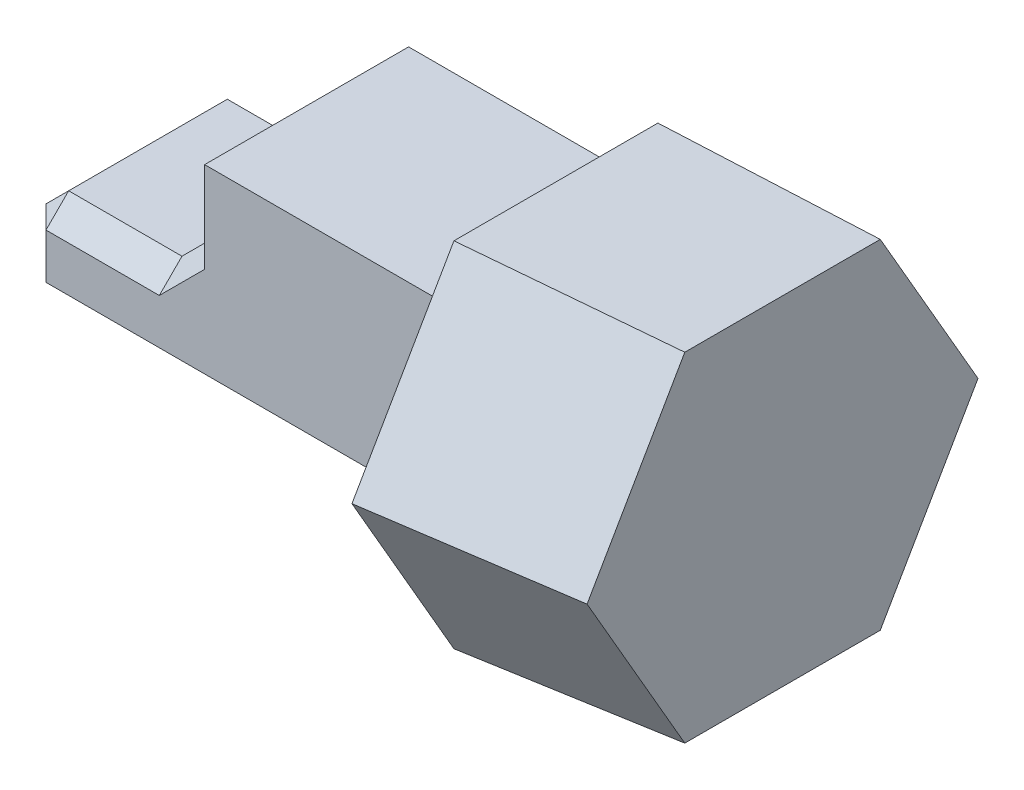
ISO-10303-21;
HEADER;
FILE_DESCRIPTION(('STEP AP214'),'2;1');
FILE_NAME('part.step','',(''),(''),'','','');
FILE_SCHEMA(('AUTOMOTIVE_DESIGN { 1 0 10303 214 1 1 1 1 }'));
ENDSEC;
DATA;
#1=APPLICATION_CONTEXT('core data for automotive mechanical design processes');
#2=APPLICATION_PROTOCOL_DEFINITION('international standard','automotive_design',2000,#1);
#3=PRODUCT_CONTEXT('',#1,'mechanical');
#4=PRODUCT('Part','Part','',(#3));
#5=PRODUCT_RELATED_PRODUCT_CATEGORY('part','',(#4));
#6=PRODUCT_DEFINITION_FORMATION('','',#4);
#7=PRODUCT_DEFINITION_CONTEXT('part definition',#1,'design');
#8=PRODUCT_DEFINITION('design','',#6,#7);
#9=PRODUCT_DEFINITION_SHAPE('','',#8);
#10=(LENGTH_UNIT() NAMED_UNIT(*) SI_UNIT(.MILLI.,.METRE.));
#11=(NAMED_UNIT(*) PLANE_ANGLE_UNIT() SI_UNIT($,.RADIAN.));
#12=(NAMED_UNIT(*) SI_UNIT($,.STERADIAN.) SOLID_ANGLE_UNIT());
#13=UNCERTAINTY_MEASURE_WITH_UNIT(LENGTH_MEASURE(1.E-05),#10,'distance_accuracy_value','');
#14=(GEOMETRIC_REPRESENTATION_CONTEXT(3) GLOBAL_UNCERTAINTY_ASSIGNED_CONTEXT((#13)) GLOBAL_UNIT_ASSIGNED_CONTEXT((#10,
#11,#12)) REPRESENTATION_CONTEXT('',''));
#15=CARTESIAN_POINT('',(0.,0.,0.));
#16=DIRECTION('',(0.,0.,1.));
#17=DIRECTION('',(1.,0.,0.));
#18=AXIS2_PLACEMENT_3D('',#15,#16,#17);
#19=CARTESIAN_POINT('',(0.,-6.59911357683742,3.81));
#20=DIRECTION('',(0.0809236037174117,-0.498360153493783,0.863185106319056));
#21=DIRECTION('',(0.,0.866025403784439,0.5));
#22=AXIS2_PLACEMENT_3D('',#19,#20,#21);
#23=PLANE('',#22);
#24=DIRECTION('',(0.9914964278646,0.12879916414384,-0.0185905580224614));
#25=VECTOR('',#24,1.);
#26=CARTESIAN_POINT('',(-50.8,-13.1982271536748,4.76250000000001));
#27=LINE('',#26,#25);
#28=CARTESIAN_POINT('',(-101.6,-19.7973407305123,5.71500000000002));
#29=VERTEX_POINT('',#28);
#30=CARTESIAN_POINT('',(-88.9,-18.1475623363029,5.47687500000001));
#31=VERTEX_POINT('',#30);
#32=EDGE_CURVE('E503',#29,#31,#27,.T.);
#33=ORIENTED_EDGE('',*,*,#32,.T.);
#34=DIRECTION('',(0.,0.866025403784439,0.5));
#35=VECTOR('',#34,1.);
#36=CARTESIAN_POINT('',(-88.9,-10.2080038141704,10.06078125));
#37=LINE('',#36,#35);
#38=CARTESIAN_POINT('',(-88.9,-8.66133656959912,10.95375));
#39=VERTEX_POINT('',#38);
#40=EDGE_CURVE('E475',#31,#39,#37,.T.);
#41=ORIENTED_EDGE('',*,*,#40,.T.);
#42=DIRECTION('',(-0.994594921525046,-0.096901252708014,0.0372973095571894));
#43=VECTOR('',#42,1.);
#44=CARTESIAN_POINT('',(-50.8,-4.94933518262807,9.52500000000001));
#45=LINE('',#44,#43);
#46=CARTESIAN_POINT('',(-101.6,-9.89867036525613,11.43));
#47=VERTEX_POINT('',#46);
#48=EDGE_CURVE('E135',#39,#47,#45,.T.);
#49=ORIENTED_EDGE('',*,*,#48,.T.);
#50=DIRECTION('',(0.,0.866025403784439,0.5));
#51=VECTOR('',#50,1.);
#52=CARTESIAN_POINT('',(-101.6,-19.7973407305123,5.71500000000002));
#53=LINE('',#52,#51);
#54=EDGE_CURVE('E315',#29,#47,#53,.T.);
#55=ORIENTED_EDGE('',*,*,#54,.F.);
#56=EDGE_LOOP('',(#33,#41,#49,#55));
#57=FACE_BOUND('',#56,.T.);
#58=ADVANCED_FACE('F131',(#57),#23,.T.);
#59=CARTESIAN_POINT('',(0.,0.,7.62));
#60=DIRECTION('',(-0.0162358359953752,0.499934095063922,0.865911253086682));
#61=DIRECTION('',(0.,0.866025403784439,-0.5));
#62=AXIS2_PLACEMENT_3D('',#59,#60,#61);
#63=PLANE('',#62);
#64=ORIENTED_EDGE('',*,*,#48,.F.);
#65=DIRECTION('',(0.,0.866025403784439,-0.5));
#66=VECTOR('',#65,1.);
#67=CARTESIAN_POINT('',(-88.9,-0.721778047466586,6.36984375000001));
#68=LINE('',#67,#66);
#69=CARTESIAN_POINT('',(-88.9,0.824889197104678,5.476875));
#70=VERTEX_POINT('',#69);
#71=EDGE_CURVE('E471',#39,#70,#68,.T.);
#72=ORIENTED_EDGE('',*,*,#71,.T.);
#73=DIRECTION('',(-0.997722646945075,-0.0648039868639116,0.0187072996302202));
#74=VECTOR('',#73,1.);
#75=CARTESIAN_POINT('',(-50.8,3.29955678841871,4.7625));
#76=LINE('',#75,#74);
#77=CARTESIAN_POINT('',(-101.6,0.,5.71500000000001));
#78=VERTEX_POINT('',#77);
#79=EDGE_CURVE('E299',#70,#78,#76,.T.);
#80=ORIENTED_EDGE('',*,*,#79,.T.);
#81=DIRECTION('',(0.,0.866025403784438,-0.500000000000001));
#82=VECTOR('',#81,1.);
#83=CARTESIAN_POINT('',(-101.6,-9.89867036525613,11.43));
#84=LINE('',#83,#82);
#85=EDGE_CURVE('E297',#47,#78,#84,.T.);
#86=ORIENTED_EDGE('',*,*,#85,.F.);
#87=EDGE_LOOP('',(#64,#72,#80,#86));
#88=FACE_BOUND('',#87,.T.);
#89=ADVANCED_FACE('F332',(#88),#63,.T.);
#90=CARTESIAN_POINT('',(0.,-6.59911357683742,-3.81));
#91=DIRECTION('',(0.128821426980026,-0.991667807257466,0.));
#92=DIRECTION('',(0.,0.,1.));
#93=AXIS2_PLACEMENT_3D('',#90,#91,#92);
#94=PLANE('',#93);
#95=DIRECTION('',(-0.9914964278646,-0.12879916414384,-0.0185905580224612));
#96=VECTOR('',#95,1.);
#97=CARTESIAN_POINT('',(-50.8,-13.1982271536748,-4.76249999999999));
#98=LINE('',#97,#96);
#99=CARTESIAN_POINT('',(-88.9,-18.1475623363029,-5.47687499999999));
#100=VERTEX_POINT('',#99);
#101=CARTESIAN_POINT('',(-101.6,-19.7973407305123,-5.71499999999999));
#102=VERTEX_POINT('',#101);
#103=EDGE_CURVE('E295',#100,#102,#98,.T.);
#104=ORIENTED_EDGE('',*,*,#103,.F.);
#105=DIRECTION('',(0.,0.,1.));
#106=VECTOR('',#105,1.);
#107=CARTESIAN_POINT('',(-88.9,-18.1475623363029,-3.81));
#108=LINE('',#107,#106);
#109=EDGE_CURVE('E149',#100,#31,#108,.T.);
#110=ORIENTED_EDGE('',*,*,#109,.T.);
#111=ORIENTED_EDGE('',*,*,#32,.F.);
#112=DIRECTION('',(0.,0.,1.));
#113=VECTOR('',#112,1.);
#114=CARTESIAN_POINT('',(-101.6,-19.7973407305123,0.));
#115=LINE('',#114,#113);
#116=CARTESIAN_POINT('',(-101.6,-19.7973407305123,0.));
#117=VERTEX_POINT('',#116);
#118=EDGE_CURVE('E510',#117,#29,#115,.T.);
#119=ORIENTED_EDGE('',*,*,#118,.F.);
#120=DIRECTION('',(0.,0.,1.));
#121=VECTOR('',#120,1.);
#122=CARTESIAN_POINT('',(-101.6,-19.7973407305123,-5.71499999999999));
#123=LINE('',#122,#121);
#124=EDGE_CURVE('E524',#102,#117,#123,.T.);
#125=ORIENTED_EDGE('',*,*,#124,.F.);
#126=EDGE_LOOP('',(#104,#110,#111,#119,#125));
#127=FACE_BOUND('',#126,.T.);
#128=ADVANCED_FACE('F338',(#127),#94,.T.);
#129=CARTESIAN_POINT('',(0.,6.59911357683743,3.81));
#130=DIRECTION('',(-0.0648153293418385,0.997897275816659,0.));
#131=DIRECTION('',(0.,0.,-1.));
#132=AXIS2_PLACEMENT_3D('',#129,#130,#131);
#133=PLANE('',#132);
#134=ORIENTED_EDGE('',*,*,#79,.F.);
#135=DIRECTION('',(0.,0.,-1.));
#136=VECTOR('',#135,1.);
#137=CARTESIAN_POINT('',(-88.9,0.824889197104679,3.81));
#138=LINE('',#137,#136);
#139=CARTESIAN_POINT('',(-88.9,0.824889197104678,-5.47687499999999));
#140=VERTEX_POINT('',#139);
#141=EDGE_CURVE('E288',#70,#140,#138,.T.);
#142=ORIENTED_EDGE('',*,*,#141,.T.);
#143=DIRECTION('',(-0.997722646945075,-0.0648039868639116,-0.0187072996302201));
#144=VECTOR('',#143,1.);
#145=CARTESIAN_POINT('',(-50.8,3.29955678841871,-4.76249999999999));
#146=LINE('',#145,#144);
#147=CARTESIAN_POINT('',(-101.6,0.,-5.71499999999999));
#148=VERTEX_POINT('',#147);
#149=EDGE_CURVE('E287',#140,#148,#146,.T.);
#150=ORIENTED_EDGE('',*,*,#149,.T.);
#151=DIRECTION('',(0.,0.,-1.));
#152=VECTOR('',#151,1.);
#153=CARTESIAN_POINT('',(-101.6,0.,0.));
#154=LINE('',#153,#152);
#155=CARTESIAN_POINT('',(-101.6,0.,0.));
#156=VERTEX_POINT('',#155);
#157=EDGE_CURVE('E463',#156,#148,#154,.T.);
#158=ORIENTED_EDGE('',*,*,#157,.F.);
#159=DIRECTION('',(0.,0.,-1.));
#160=VECTOR('',#159,1.);
#161=CARTESIAN_POINT('',(-101.6,0.,5.715));
#162=LINE('',#161,#160);
#163=EDGE_CURVE('E355',#78,#156,#162,.T.);
#164=ORIENTED_EDGE('',*,*,#163,.F.);
#165=EDGE_LOOP('',(#134,#142,#150,#158,#164));
#166=FACE_BOUND('',#165,.T.);
#167=ADVANCED_FACE('F361',(#166),#133,.T.);
#168=CARTESIAN_POINT('',(0.,6.59911357683742,-3.80999999999999));
#169=DIRECTION('',(-0.0162358359953753,0.499934095063922,-0.865911253086682));
#170=DIRECTION('',(0.,-0.866025403784438,-0.5));
#171=AXIS2_PLACEMENT_3D('',#168,#169,#170);
#172=PLANE('',#171);
#173=ORIENTED_EDGE('',*,*,#149,.F.);
#174=DIRECTION('',(0.,-0.866025403784438,-0.5));
#175=VECTOR('',#174,1.);
#176=CARTESIAN_POINT('',(-88.9,5.87733552937083,-2.55984374999999));
#177=LINE('',#176,#175);
#178=CARTESIAN_POINT('',(-88.9,-8.66133656959911,-10.95375));
#179=VERTEX_POINT('',#178);
#180=EDGE_CURVE('E276',#140,#179,#177,.T.);
#181=ORIENTED_EDGE('',*,*,#180,.T.);
#182=DIRECTION('',(-0.994594921525046,-0.096901252708014,-0.0372973095571892));
#183=VECTOR('',#182,1.);
#184=CARTESIAN_POINT('',(-50.8,-4.94933518262806,-9.52499999999999));
#185=LINE('',#184,#183);
#186=CARTESIAN_POINT('',(-101.6,-9.89867036525613,-11.43));
#187=VERTEX_POINT('',#186);
#188=EDGE_CURVE('E285',#179,#187,#185,.T.);
#189=ORIENTED_EDGE('',*,*,#188,.T.);
#190=DIRECTION('',(0.,-0.866025403784439,-0.5));
#191=VECTOR('',#190,1.);
#192=CARTESIAN_POINT('',(-101.6,0.,-5.71499999999999));
#193=LINE('',#192,#191);
#194=EDGE_CURVE('E382',#148,#187,#193,.T.);
#195=ORIENTED_EDGE('',*,*,#194,.F.);
#196=EDGE_LOOP('',(#173,#181,#189,#195));
#197=FACE_BOUND('',#196,.T.);
#198=ADVANCED_FACE('F283',(#197),#172,.T.);
#199=CARTESIAN_POINT('',(0.,0.,-7.61999999999999));
#200=DIRECTION('',(0.0809236037174114,-0.498360153493782,-0.863185106319057));
#201=DIRECTION('',(0.,-0.866025403784439,0.499999999999999));
#202=AXIS2_PLACEMENT_3D('',#199,#200,#201);
#203=PLANE('',#202);
#204=ORIENTED_EDGE('',*,*,#188,.F.);
#205=DIRECTION('',(0.,-0.866025403784439,0.499999999999999));
#206=VECTOR('',#205,1.);
#207=CARTESIAN_POINT('',(-88.9,-3.60889023733295,-13.87078125));
#208=LINE('',#207,#206);
#209=EDGE_CURVE('E12',#179,#100,#208,.T.);
#210=ORIENTED_EDGE('',*,*,#209,.T.);
#211=ORIENTED_EDGE('',*,*,#103,.T.);
#212=DIRECTION('',(0.,-0.866025403784439,0.5));
#213=VECTOR('',#212,1.);
#214=CARTESIAN_POINT('',(-101.6,-9.89867036525613,-11.43));
#215=LINE('',#214,#213);
#216=EDGE_CURVE('E292',#187,#102,#215,.T.);
#217=ORIENTED_EDGE('',*,*,#216,.F.);
#218=EDGE_LOOP('',(#204,#210,#211,#217));
#219=FACE_BOUND('',#218,.T.);
#220=ADVANCED_FACE('F290',(#219),#203,.T.);
#221=CARTESIAN_POINT('',(-116.84,0.,-5.71499999999999));
#222=DIRECTION('',(0.,0.,-1.));
#223=DIRECTION('',(-1.,0.,0.));
#224=AXIS2_PLACEMENT_3D('',#221,#222,#223);
#225=PLANE('',#224);
#226=DIRECTION('',(1.,0.,0.));
#227=VECTOR('',#226,1.);
#228=CARTESIAN_POINT('',(-116.84,-13.4473407305123,-5.71499999999999));
#229=LINE('',#228,#227);
#230=CARTESIAN_POINT('',(-124.46,-13.4473407305123,-5.71499999999999));
#231=VERTEX_POINT('',#230);
#232=CARTESIAN_POINT('',(-101.6,-13.4473407305123,-5.71499999999999));
#233=VERTEX_POINT('',#232);
#234=EDGE_CURVE('E495',#231,#233,#229,.T.);
#235=ORIENTED_EDGE('',*,*,#234,.F.);
#236=DIRECTION('',(0.,1.,0.));
#237=VECTOR('',#236,1.);
#238=CARTESIAN_POINT('',(-124.46,-9.63734073051227,-5.71499999999999));
#239=LINE('',#238,#237);
#240=CARTESIAN_POINT('',(-124.46,-10.9073407305123,-5.71499999999999));
#241=VERTEX_POINT('',#240);
#242=EDGE_CURVE('E795',#231,#241,#239,.T.);
#243=ORIENTED_EDGE('',*,*,#242,.T.);
#244=DIRECTION('',(1.,0.,0.));
#245=VECTOR('',#244,1.);
#246=CARTESIAN_POINT('',(-116.84,-10.9073407305123,-5.71499999999999));
#247=LINE('',#246,#245);
#248=CARTESIAN_POINT('',(-118.11,-10.9073407305123,-5.71499999999999));
#249=VERTEX_POINT('',#248);
#250=EDGE_CURVE('E804',#241,#249,#247,.T.);
#251=ORIENTED_EDGE('',*,*,#250,.T.);
#252=DIRECTION('',(-0.707106781186555,-0.70710678118654,0.));
#253=VECTOR('',#252,1.);
#254=CARTESIAN_POINT('',(-112.021329634744,-4.81867036525625,-5.71499999999999));
#255=LINE('',#254,#253);
#256=CARTESIAN_POINT('',(-116.84,-9.63734073051227,-5.71499999999999));
#257=VERTEX_POINT('',#256);
#258=EDGE_CURVE('E809',#257,#249,#255,.T.);
#259=ORIENTED_EDGE('',*,*,#258,.F.);
#260=DIRECTION('',(-0.707106781186555,-0.70710678118654,0.));
#261=VECTOR('',#260,1.);
#262=CARTESIAN_POINT('',(-112.021329634744,-4.81867036525625,-5.71499999999999));
#263=LINE('',#262,#261);
#264=CARTESIAN_POINT('',(-115.57,-8.36734073051227,-5.71499999999999));
#265=VERTEX_POINT('',#264);
#266=EDGE_CURVE('E901',#265,#257,#263,.T.);
#267=ORIENTED_EDGE('',*,*,#266,.F.);
#268=DIRECTION('',(0.,1.,0.));
#269=VECTOR('',#268,1.);
#270=CARTESIAN_POINT('',(-115.57,0.,-5.71499999999999));
#271=LINE('',#270,#269);
#272=CARTESIAN_POINT('',(-115.57,-3.28734073051226,-5.71499999999999));
#273=VERTEX_POINT('',#272);
#274=EDGE_CURVE('E895',#265,#273,#271,.T.);
#275=ORIENTED_EDGE('',*,*,#274,.T.);
#276=DIRECTION('',(1.,0.,0.));
#277=VECTOR('',#276,1.);
#278=CARTESIAN_POINT('',(-116.84,-3.28734073051226,-5.71499999999999));
#279=LINE('',#278,#277);
#280=CARTESIAN_POINT('',(-101.6,-3.28734073051226,-5.71499999999999));
#281=VERTEX_POINT('',#280);
#282=EDGE_CURVE('E497',#273,#281,#279,.T.);
#283=ORIENTED_EDGE('',*,*,#282,.T.);
#284=DIRECTION('',(0.,1.,0.));
#285=VECTOR('',#284,1.);
#286=CARTESIAN_POINT('',(-101.6,0.,-5.71499999999999));
#287=LINE('',#286,#285);
#288=EDGE_CURVE('E492',#233,#281,#287,.T.);
#289=ORIENTED_EDGE('',*,*,#288,.F.);
#290=EDGE_LOOP('',(#235,#243,#251,#259,#267,#275,#283,#289));
#291=FACE_BOUND('',#290,.T.);
#292=ADVANCED_FACE('F405',(#291),#225,.T.);
#293=CARTESIAN_POINT('',(-101.6,0.,0.));
#294=DIRECTION('',(-1.,0.,0.));
#295=DIRECTION('',(0.,0.,1.));
#296=AXIS2_PLACEMENT_3D('',#293,#294,#295);
#297=PLANE('',#296);
#298=DIRECTION('',(0.,0.,1.));
#299=VECTOR('',#298,1.);
#300=CARTESIAN_POINT('',(-101.6,-13.4473407305123,0.));
#301=LINE('',#300,#299);
#302=CARTESIAN_POINT('',(-101.6,-13.4473407305123,5.71500000000002));
#303=VERTEX_POINT('',#302);
#304=EDGE_CURVE('E482',#233,#303,#301,.T.);
#305=ORIENTED_EDGE('',*,*,#304,.F.);
#306=ORIENTED_EDGE('',*,*,#288,.T.);
#307=DIRECTION('',(0.,0.,1.));
#308=VECTOR('',#307,1.);
#309=CARTESIAN_POINT('',(-101.6,-3.28734073051226,0.));
#310=LINE('',#309,#308);
#311=CARTESIAN_POINT('',(-101.6,-3.28734073051226,5.71500000000002));
#312=VERTEX_POINT('',#311);
#313=EDGE_CURVE('E489',#281,#312,#310,.T.);
#314=ORIENTED_EDGE('',*,*,#313,.T.);
#315=DIRECTION('',(0.,1.,0.));
#316=VECTOR('',#315,1.);
#317=CARTESIAN_POINT('',(-101.6,0.,5.71500000000002));
#318=LINE('',#317,#316);
#319=EDGE_CURVE('E486',#303,#312,#318,.T.);
#320=ORIENTED_EDGE('',*,*,#319,.F.);
#321=EDGE_LOOP('',(#305,#306,#314,#320));
#322=FACE_BOUND('',#321,.T.);
#323=ORIENTED_EDGE('',*,*,#85,.T.);
#324=ORIENTED_EDGE('',*,*,#163,.T.);
#325=ORIENTED_EDGE('',*,*,#157,.T.);
#326=ORIENTED_EDGE('',*,*,#194,.T.);
#327=ORIENTED_EDGE('',*,*,#216,.T.);
#328=ORIENTED_EDGE('',*,*,#124,.T.);
#329=ORIENTED_EDGE('',*,*,#118,.T.);
#330=ORIENTED_EDGE('',*,*,#54,.T.);
#331=EDGE_LOOP('',(#323,#324,#325,#326,#327,#328,#329,#330));
#332=FACE_BOUND('',#331,.T.);
#333=ADVANCED_FACE('F406',(#322,#332),#297,.T.);
#334=CARTESIAN_POINT('',(-116.84,-13.4473407305123,0.));
#335=DIRECTION('',(0.,1.,0.));
#336=DIRECTION('',(0.,0.,1.));
#337=AXIS2_PLACEMENT_3D('',#334,#335,#336);
#338=PLANE('',#337);
#339=DIRECTION('',(0.,0.,1.));
#340=VECTOR('',#339,1.);
#341=CARTESIAN_POINT('',(-125.73,-13.4473407305123,-5.71499999999999));
#342=LINE('',#341,#340);
#343=CARTESIAN_POINT('',(-125.73,-13.4473407305123,-4.44499999999997));
#344=VERTEX_POINT('',#343);
#345=CARTESIAN_POINT('',(-125.73,-13.4473407305123,4.445));
#346=VERTEX_POINT('',#345);
#347=EDGE_CURVE('E479',#344,#346,#342,.T.);
#348=ORIENTED_EDGE('',*,*,#347,.F.);
#349=DIRECTION('',(0.707106781186555,0.,-0.70710678118654));
#350=VECTOR('',#349,1.);
#351=CARTESIAN_POINT('',(-125.73,-13.4473407305123,-4.44499999999997));
#352=LINE('',#351,#350);
#353=EDGE_CURVE('E800',#344,#231,#352,.T.);
#354=ORIENTED_EDGE('',*,*,#353,.T.);
#355=ORIENTED_EDGE('',*,*,#234,.T.);
#356=ORIENTED_EDGE('',*,*,#304,.T.);
#357=DIRECTION('',(1.,0.,0.));
#358=VECTOR('',#357,1.);
#359=CARTESIAN_POINT('',(-116.84,-13.4473407305123,5.71500000000002));
#360=LINE('',#359,#358);
#361=CARTESIAN_POINT('',(-124.46,-13.4473407305123,5.71500000000002));
#362=VERTEX_POINT('',#361);
#363=EDGE_CURVE('E501',#362,#303,#360,.T.);
#364=ORIENTED_EDGE('',*,*,#363,.F.);
#365=DIRECTION('',(0.707106781186556,0.,0.70710678118654));
#366=VECTOR('',#365,1.);
#367=CARTESIAN_POINT('',(-125.73,-13.4473407305123,4.445));
#368=LINE('',#367,#366);
#369=EDGE_CURVE('E887',#362,#346,#368,.F.);
#370=ORIENTED_EDGE('',*,*,#369,.T.);
#371=EDGE_LOOP('',(#348,#354,#355,#356,#364,#370));
#372=FACE_BOUND('',#371,.T.);
#373=ADVANCED_FACE('F333',(#372),#338,.F.);
#374=CARTESIAN_POINT('',(-116.84,0.,5.71500000000002));
#375=DIRECTION('',(0.,0.,-1.));
#376=DIRECTION('',(-1.,0.,0.));
#377=AXIS2_PLACEMENT_3D('',#374,#375,#376);
#378=PLANE('',#377);
#379=DIRECTION('',(-1.,0.,0.));
#380=VECTOR('',#379,1.);
#381=CARTESIAN_POINT('',(-116.84,-10.9073407305123,5.71500000000002));
#382=LINE('',#381,#380);
#383=CARTESIAN_POINT('',(-118.11,-10.9073407305123,5.71500000000002));
#384=VERTEX_POINT('',#383);
#385=CARTESIAN_POINT('',(-124.46,-10.9073407305123,5.71500000000002));
#386=VERTEX_POINT('',#385);
#387=EDGE_CURVE('E817',#384,#386,#382,.T.);
#388=ORIENTED_EDGE('',*,*,#387,.T.);
#389=DIRECTION('',(0.,-1.,0.));
#390=VECTOR('',#389,1.);
#391=CARTESIAN_POINT('',(-124.46,0.,5.71500000000002));
#392=LINE('',#391,#390);
#393=EDGE_CURVE('E819',#386,#362,#392,.T.);
#394=ORIENTED_EDGE('',*,*,#393,.T.);
#395=ORIENTED_EDGE('',*,*,#363,.T.);
#396=ORIENTED_EDGE('',*,*,#319,.T.);
#397=DIRECTION('',(1.,0.,0.));
#398=VECTOR('',#397,1.);
#399=CARTESIAN_POINT('',(-116.84,-3.28734073051226,5.71500000000002));
#400=LINE('',#399,#398);
#401=CARTESIAN_POINT('',(-115.57,-3.28734073051226,5.71500000000002));
#402=VERTEX_POINT('',#401);
#403=EDGE_CURVE('E499',#402,#312,#400,.T.);
#404=ORIENTED_EDGE('',*,*,#403,.F.);
#405=DIRECTION('',(0.,-1.,0.));
#406=VECTOR('',#405,1.);
#407=CARTESIAN_POINT('',(-115.57,-9.63734073051227,5.71500000000002));
#408=LINE('',#407,#406);
#409=CARTESIAN_POINT('',(-115.57,-8.36734073051227,5.71500000000002));
#410=VERTEX_POINT('',#409);
#411=EDGE_CURVE('E815',#402,#410,#408,.T.);
#412=ORIENTED_EDGE('',*,*,#411,.T.);
#413=DIRECTION('',(0.707106781186555,0.70710678118654,0.));
#414=VECTOR('',#413,1.);
#415=CARTESIAN_POINT('',(-115.57,-8.36734073051225,5.71500000000002));
#416=LINE('',#415,#414);
#417=CARTESIAN_POINT('',(-116.84,-9.63734073051227,5.71500000000002));
#418=VERTEX_POINT('',#417);
#419=EDGE_CURVE('E803',#418,#410,#416,.T.);
#420=ORIENTED_EDGE('',*,*,#419,.F.);
#421=DIRECTION('',(0.707106781186555,0.70710678118654,0.));
#422=VECTOR('',#421,1.);
#423=CARTESIAN_POINT('',(-115.57,-8.36734073051225,5.71500000000002));
#424=LINE('',#423,#422);
#425=EDGE_CURVE('E807',#384,#418,#424,.T.);
#426=ORIENTED_EDGE('',*,*,#425,.F.);
#427=EDGE_LOOP('',(#388,#394,#395,#396,#404,#412,#420,#426));
#428=FACE_BOUND('',#427,.T.);
#429=ADVANCED_FACE('F708',(#428),#378,.F.);
#430=CARTESIAN_POINT('',(-116.84,-3.28734073051226,0.));
#431=DIRECTION('',(0.,1.,0.));
#432=DIRECTION('',(0.,0.,1.));
#433=AXIS2_PLACEMENT_3D('',#430,#431,#432);
#434=PLANE('',#433);
#435=ORIENTED_EDGE('',*,*,#282,.F.);
#436=DIRECTION('',(0.,0.,1.));
#437=VECTOR('',#436,1.);
#438=CARTESIAN_POINT('',(-115.57,-3.28734073051226,0.));
#439=LINE('',#438,#437);
#440=EDGE_CURVE('E830',#273,#402,#439,.T.);
#441=ORIENTED_EDGE('',*,*,#440,.T.);
#442=ORIENTED_EDGE('',*,*,#403,.T.);
#443=ORIENTED_EDGE('',*,*,#313,.F.);
#444=EDGE_LOOP('',(#435,#441,#442,#443));
#445=FACE_BOUND('',#444,.T.);
#446=ADVANCED_FACE('F700',(#445),#434,.T.);
#447=CARTESIAN_POINT('',(-116.84,0.,0.));
#448=DIRECTION('',(-1.,0.,0.));
#449=DIRECTION('',(0.,0.,1.));
#450=AXIS2_PLACEMENT_3D('',#447,#448,#449);
#451=PLANE('',#450);
#452=DIRECTION('',(0.,1.,0.));
#453=VECTOR('',#452,1.);
#454=CARTESIAN_POINT('',(-116.84,-3.28734073051226,4.44500000000003));
#455=LINE('',#454,#453);
#456=CARTESIAN_POINT('',(-116.84,-8.36734073051227,4.44500000000003));
#457=VERTEX_POINT('',#456);
#458=CARTESIAN_POINT('',(-116.84,-4.55734073051226,4.44500000000003));
#459=VERTEX_POINT('',#458);
#460=EDGE_CURVE('E832',#457,#459,#455,.T.);
#461=ORIENTED_EDGE('',*,*,#460,.T.);
#462=DIRECTION('',(0.,0.,-1.));
#463=VECTOR('',#462,1.);
#464=CARTESIAN_POINT('',(-116.84,-4.55734073051226,0.));
#465=LINE('',#464,#463);
#466=CARTESIAN_POINT('',(-116.84,-4.55734073051226,-4.445));
#467=VERTEX_POINT('',#466);
#468=EDGE_CURVE('E141',#459,#467,#465,.T.);
#469=ORIENTED_EDGE('',*,*,#468,.T.);
#470=DIRECTION('',(0.,-1.,0.));
#471=VECTOR('',#470,1.);
#472=CARTESIAN_POINT('',(-116.84,0.,-4.445));
#473=LINE('',#472,#471);
#474=CARTESIAN_POINT('',(-116.84,-8.36734073051227,-4.445));
#475=VERTEX_POINT('',#474);
#476=EDGE_CURVE('E156',#467,#475,#473,.T.);
#477=ORIENTED_EDGE('',*,*,#476,.T.);
#478=DIRECTION('',(0.,0.,1.));
#479=VECTOR('',#478,1.);
#480=CARTESIAN_POINT('',(-116.84,-8.36734073051227,0.));
#481=LINE('',#480,#479);
#482=EDGE_CURVE('E834',#475,#457,#481,.T.);
#483=ORIENTED_EDGE('',*,*,#482,.T.);
#484=EDGE_LOOP('',(#461,#469,#477,#483));
#485=FACE_BOUND('',#484,.T.);
#486=ADVANCED_FACE('F692',(#485),#451,.T.);
#487=CARTESIAN_POINT('',(-125.73,-9.63734073051227,-5.71499999999999));
#488=DIRECTION('',(0.,-1.,0.));
#489=DIRECTION('',(0.,0.,-1.));
#490=AXIS2_PLACEMENT_3D('',#487,#488,#489);
#491=PLANE('',#490);
#492=DIRECTION('',(-1.,0.,0.));
#493=VECTOR('',#492,1.);
#494=CARTESIAN_POINT('',(-125.73,-9.63734073051227,-4.445));
#495=LINE('',#494,#493);
#496=CARTESIAN_POINT('',(-118.11,-9.63734073051227,-4.445));
#497=VERTEX_POINT('',#496);
#498=CARTESIAN_POINT('',(-124.46,-9.63734073051227,-4.445));
#499=VERTEX_POINT('',#498);
#500=EDGE_CURVE('E825',#497,#499,#495,.T.);
#501=ORIENTED_EDGE('',*,*,#500,.T.);
#502=DIRECTION('',(0.,0.,1.));
#503=VECTOR('',#502,1.);
#504=CARTESIAN_POINT('',(-124.46,-9.63734073051227,-5.71499999999999));
#505=LINE('',#504,#503);
#506=CARTESIAN_POINT('',(-124.46,-9.63734073051227,4.445));
#507=VERTEX_POINT('',#506);
#508=EDGE_CURVE('E827',#499,#507,#505,.T.);
#509=ORIENTED_EDGE('',*,*,#508,.T.);
#510=DIRECTION('',(1.,0.,0.));
#511=VECTOR('',#510,1.);
#512=CARTESIAN_POINT('',(-125.73,-9.63734073051227,4.445));
#513=LINE('',#512,#511);
#514=CARTESIAN_POINT('',(-118.11,-9.63734073051227,4.445));
#515=VERTEX_POINT('',#514);
#516=EDGE_CURVE('E823',#507,#515,#513,.T.);
#517=ORIENTED_EDGE('',*,*,#516,.T.);
#518=DIRECTION('',(0.,0.,-1.));
#519=VECTOR('',#518,1.);
#520=CARTESIAN_POINT('',(-118.11,-9.63734073051227,-5.71499999999999));
#521=LINE('',#520,#519);
#522=EDGE_CURVE('E821',#515,#497,#521,.T.);
#523=ORIENTED_EDGE('',*,*,#522,.T.);
#524=EDGE_LOOP('',(#501,#509,#517,#523));
#525=FACE_BOUND('',#524,.T.);
#526=ADVANCED_FACE('F684',(#525),#491,.F.);
#527=CARTESIAN_POINT('',(-125.73,0.,0.));
#528=DIRECTION('',(1.,0.,0.));
#529=DIRECTION('',(0.,0.,-1.));
#530=AXIS2_PLACEMENT_3D('',#527,#528,#529);
#531=PLANE('',#530);
#532=DIRECTION('',(0.,0.,-1.));
#533=VECTOR('',#532,1.);
#534=CARTESIAN_POINT('',(-125.73,-10.9073407305123,0.));
#535=LINE('',#534,#533);
#536=CARTESIAN_POINT('',(-125.73,-10.9073407305123,4.445));
#537=VERTEX_POINT('',#536);
#538=CARTESIAN_POINT('',(-125.73,-10.9073407305123,-4.44499999999997));
#539=VERTEX_POINT('',#538);
#540=EDGE_CURVE('E511',#537,#539,#535,.T.);
#541=ORIENTED_EDGE('',*,*,#540,.T.);
#542=DIRECTION('',(0.,-1.,0.));
#543=VECTOR('',#542,1.);
#544=CARTESIAN_POINT('',(-125.73,-13.4473407305123,-4.44499999999997));
#545=LINE('',#544,#543);
#546=EDGE_CURVE('E893',#539,#344,#545,.T.);
#547=ORIENTED_EDGE('',*,*,#546,.T.);
#548=ORIENTED_EDGE('',*,*,#347,.T.);
#549=DIRECTION('',(0.,1.,0.));
#550=VECTOR('',#549,1.);
#551=CARTESIAN_POINT('',(-125.73,0.,4.445));
#552=LINE('',#551,#550);
#553=EDGE_CURVE('E892',#346,#537,#552,.T.);
#554=ORIENTED_EDGE('',*,*,#553,.T.);
#555=EDGE_LOOP('',(#541,#547,#548,#554));
#556=FACE_BOUND('',#555,.T.);
#557=ADVANCED_FACE('F677',(#556),#531,.F.);
#558=CARTESIAN_POINT('',(-116.84,0.,4.44500000000003));
#559=DIRECTION('',(-0.70710678118654,0.,0.707106781186556));
#560=DIRECTION('',(0.,-1.,0.));
#561=AXIS2_PLACEMENT_3D('',#558,#559,#560);
#562=PLANE('',#561);
#563=DIRECTION('',(-0.707106781186556,0.,-0.70710678118654));
#564=VECTOR('',#563,1.);
#565=CARTESIAN_POINT('',(-115.57,-8.36734073051227,5.71500000000002));
#566=LINE('',#565,#564);
#567=EDGE_CURVE('E871',#410,#457,#566,.T.);
#568=ORIENTED_EDGE('',*,*,#567,.F.);
#569=ORIENTED_EDGE('',*,*,#411,.F.);
#570=DIRECTION('',(0.577350269189634,0.577350269189622,0.577350269189621));
#571=VECTOR('',#570,1.);
#572=CARTESIAN_POINT('',(-115.320886423163,-3.03822715367486,5.96411357683742));
#573=LINE('',#572,#571);
#574=EDGE_CURVE('E483',#459,#402,#573,.T.);
#575=ORIENTED_EDGE('',*,*,#574,.F.);
#576=ORIENTED_EDGE('',*,*,#460,.F.);
#577=EDGE_LOOP('',(#568,#569,#575,#576));
#578=FACE_BOUND('',#577,.T.);
#579=ADVANCED_FACE('F133',(#578),#562,.T.);
#580=CARTESIAN_POINT('',(-115.57,-3.28734073051226,0.));
#581=DIRECTION('',(0.70710678118654,-0.707106781186555,0.));
#582=DIRECTION('',(0.,0.,1.));
#583=AXIS2_PLACEMENT_3D('',#580,#581,#582);
#584=PLANE('',#583);
#585=ORIENTED_EDGE('',*,*,#574,.T.);
#586=ORIENTED_EDGE('',*,*,#440,.F.);
#587=DIRECTION('',(0.577350269189634,0.577350269189622,-0.577350269189622));
#588=VECTOR('',#587,1.);
#589=CARTESIAN_POINT('',(-114.474219756496,-2.19156048700819,-6.81078024350406));
#590=LINE('',#589,#588);
#591=EDGE_CURVE('E869',#467,#273,#590,.T.);
#592=ORIENTED_EDGE('',*,*,#591,.F.);
#593=ORIENTED_EDGE('',*,*,#468,.F.);
#594=EDGE_LOOP('',(#585,#586,#592,#593));
#595=FACE_BOUND('',#594,.T.);
#596=ADVANCED_FACE('F663',(#595),#584,.F.);
#597=CARTESIAN_POINT('',(-116.84,-8.36734073051227,4.44500000000003));
#598=DIRECTION('',(-0.577350269189622,0.577350269189622,0.577350269189635));
#599=DIRECTION('',(0.707106781186555,0.,0.70710678118654));
#600=AXIS2_PLACEMENT_3D('',#597,#598,#599);
#601=PLANE('',#600);
#602=ORIENTED_EDGE('',*,*,#419,.T.);
#603=ORIENTED_EDGE('',*,*,#567,.T.);
#604=DIRECTION('',(-0.707106781186555,-0.70710678118654,0.));
#605=VECTOR('',#604,1.);
#606=CARTESIAN_POINT('',(-116.84,-8.36734073051227,4.44500000000003));
#607=LINE('',#606,#605);
#608=EDGE_CURVE('E866',#515,#457,#607,.F.);
#609=ORIENTED_EDGE('',*,*,#608,.F.);
#610=DIRECTION('',(0.,-0.70710678118654,0.707106781186555));
#611=VECTOR('',#610,1.);
#612=CARTESIAN_POINT('',(-118.11,-9.63734073051227,4.445));
#613=LINE('',#612,#611);
#614=EDGE_CURVE('E863',#384,#515,#613,.F.);
#615=ORIENTED_EDGE('',*,*,#614,.F.);
#616=ORIENTED_EDGE('',*,*,#425,.T.);
#617=EDGE_LOOP('',(#602,#603,#609,#615,#616));
#618=FACE_BOUND('',#617,.T.);
#619=ADVANCED_FACE('F656',(#618),#601,.T.);
#620=CARTESIAN_POINT('',(-115.57,0.,-5.71499999999999));
#621=DIRECTION('',(0.70710678118654,0.,0.707106781186555));
#622=DIRECTION('',(0.,1.,0.));
#623=AXIS2_PLACEMENT_3D('',#620,#621,#622);
#624=PLANE('',#623);
#625=ORIENTED_EDGE('',*,*,#591,.T.);
#626=ORIENTED_EDGE('',*,*,#274,.F.);
#627=DIRECTION('',(0.707106781186555,0.,-0.70710678118654));
#628=VECTOR('',#627,1.);
#629=CARTESIAN_POINT('',(-116.84,-8.36734073051227,-4.445));
#630=LINE('',#629,#628);
#631=EDGE_CURVE('E860',#475,#265,#630,.T.);
#632=ORIENTED_EDGE('',*,*,#631,.F.);
#633=ORIENTED_EDGE('',*,*,#476,.F.);
#634=EDGE_LOOP('',(#625,#626,#632,#633));
#635=FACE_BOUND('',#634,.T.);
#636=ADVANCED_FACE('F648',(#635),#624,.F.);
#637=CARTESIAN_POINT('',(-118.11,-9.63734073051227,-5.71499999999999));
#638=DIRECTION('',(0.70710678118654,-0.707106781186555,0.));
#639=DIRECTION('',(0.,0.,-1.));
#640=AXIS2_PLACEMENT_3D('',#637,#638,#639);
#641=PLANE('',#640);
#642=ORIENTED_EDGE('',*,*,#608,.T.);
#643=ORIENTED_EDGE('',*,*,#482,.F.);
#644=DIRECTION('',(0.707106781186555,0.70710678118654,0.));
#645=VECTOR('',#644,1.);
#646=CARTESIAN_POINT('',(-118.11,-9.63734073051227,-4.445));
#647=LINE('',#646,#645);
#648=EDGE_CURVE('E857',#497,#475,#647,.T.);
#649=ORIENTED_EDGE('',*,*,#648,.F.);
#650=ORIENTED_EDGE('',*,*,#522,.F.);
#651=EDGE_LOOP('',(#642,#643,#649,#650));
#652=FACE_BOUND('',#651,.T.);
#653=ADVANCED_FACE('F640',(#652),#641,.F.);
#654=CARTESIAN_POINT('',(-125.73,-9.63734073051227,4.445));
#655=DIRECTION('',(0.,-0.707106781186555,-0.70710678118654));
#656=DIRECTION('',(1.,0.,0.));
#657=AXIS2_PLACEMENT_3D('',#654,#655,#656);
#658=PLANE('',#657);
#659=ORIENTED_EDGE('',*,*,#614,.T.);
#660=ORIENTED_EDGE('',*,*,#516,.F.);
#661=DIRECTION('',(0.,-0.70710678118654,0.707106781186555));
#662=VECTOR('',#661,1.);
#663=CARTESIAN_POINT('',(-124.46,-10.2723407305123,5.08000000000001));
#664=LINE('',#663,#662);
#665=EDGE_CURVE('E854',#386,#507,#664,.F.);
#666=ORIENTED_EDGE('',*,*,#665,.F.);
#667=ORIENTED_EDGE('',*,*,#387,.F.);
#668=EDGE_LOOP('',(#659,#660,#666,#667));
#669=FACE_BOUND('',#668,.T.);
#670=ADVANCED_FACE('F632',(#669),#658,.F.);
#671=CARTESIAN_POINT('',(-125.73,0.,4.445));
#672=DIRECTION('',(0.70710678118654,0.,-0.707106781186556));
#673=DIRECTION('',(0.,1.,0.));
#674=AXIS2_PLACEMENT_3D('',#671,#672,#673);
#675=PLANE('',#674);
#676=ORIENTED_EDGE('',*,*,#369,.F.);
#677=ORIENTED_EDGE('',*,*,#393,.F.);
#678=DIRECTION('',(-0.707106781186556,0.,-0.70710678118654));
#679=VECTOR('',#678,1.);
#680=CARTESIAN_POINT('',(-125.73,-10.9073407305123,4.445));
#681=LINE('',#680,#679);
#682=EDGE_CURVE('E851',#537,#386,#681,.F.);
#683=ORIENTED_EDGE('',*,*,#682,.F.);
#684=ORIENTED_EDGE('',*,*,#553,.F.);
#685=EDGE_LOOP('',(#676,#677,#683,#684));
#686=FACE_BOUND('',#685,.T.);
#687=ADVANCED_FACE('F624',(#686),#675,.F.);
#688=CARTESIAN_POINT('',(-118.11,-9.63734073051227,-4.445));
#689=DIRECTION('',(-0.577350269189613,0.577350269189626,-0.577350269189638));
#690=DIRECTION('',(0.,0.707106781186555,0.70710678118654));
#691=AXIS2_PLACEMENT_3D('',#688,#689,#690);
#692=PLANE('',#691);
#693=ORIENTED_EDGE('',*,*,#266,.T.);
#694=ORIENTED_EDGE('',*,*,#258,.T.);
#695=DIRECTION('',(0.,0.707106781186555,0.70710678118654));
#696=VECTOR('',#695,1.);
#697=CARTESIAN_POINT('',(-118.11,-10.9073407305123,-5.71499999999999));
#698=LINE('',#697,#696);
#699=EDGE_CURVE('E848',#497,#249,#698,.F.);
#700=ORIENTED_EDGE('',*,*,#699,.F.);
#701=ORIENTED_EDGE('',*,*,#648,.T.);
#702=ORIENTED_EDGE('',*,*,#631,.T.);
#703=EDGE_LOOP('',(#693,#694,#700,#701,#702));
#704=FACE_BOUND('',#703,.T.);
#705=ADVANCED_FACE('F616',(#704),#692,.T.);
#706=CARTESIAN_POINT('',(-125.73,-10.9073407305123,4.445));
#707=DIRECTION('',(-0.577350269189621,0.577350269189634,0.577350269189622));
#708=DIRECTION('',(0.,-0.70710678118654,0.707106781186555));
#709=AXIS2_PLACEMENT_3D('',#706,#707,#708);
#710=PLANE('',#709);
#711=ORIENTED_EDGE('',*,*,#682,.T.);
#712=ORIENTED_EDGE('',*,*,#665,.T.);
#713=DIRECTION('',(0.707106781186555,0.70710678118654,0.));
#714=VECTOR('',#713,1.);
#715=CARTESIAN_POINT('',(-125.73,-10.9073407305123,4.445));
#716=LINE('',#715,#714);
#717=EDGE_CURVE('E846',#537,#507,#716,.T.);
#718=ORIENTED_EDGE('',*,*,#717,.F.);
#719=EDGE_LOOP('',(#711,#712,#718));
#720=FACE_BOUND('',#719,.T.);
#721=ADVANCED_FACE('F608',(#720),#710,.T.);
#722=CARTESIAN_POINT('',(-116.84,-10.9073407305123,-5.71499999999999));
#723=DIRECTION('',(0.,0.70710678118654,-0.707106781186555));
#724=DIRECTION('',(-1.,0.,0.));
#725=AXIS2_PLACEMENT_3D('',#722,#723,#724);
#726=PLANE('',#725);
#727=ORIENTED_EDGE('',*,*,#699,.T.);
#728=ORIENTED_EDGE('',*,*,#250,.F.);
#729=DIRECTION('',(0.,-0.707106781186555,-0.70710678118654));
#730=VECTOR('',#729,1.);
#731=CARTESIAN_POINT('',(-124.46,-10.9073407305123,-5.71499999999999));
#732=LINE('',#731,#730);
#733=EDGE_CURVE('E843',#499,#241,#732,.T.);
#734=ORIENTED_EDGE('',*,*,#733,.F.);
#735=ORIENTED_EDGE('',*,*,#500,.F.);
#736=EDGE_LOOP('',(#727,#728,#734,#735));
#737=FACE_BOUND('',#736,.T.);
#738=ADVANCED_FACE('F600',(#737),#726,.T.);
#739=CARTESIAN_POINT('',(-125.73,-10.9073407305123,0.));
#740=DIRECTION('',(0.70710678118654,-0.707106781186555,0.));
#741=DIRECTION('',(0.,0.,-1.));
#742=AXIS2_PLACEMENT_3D('',#739,#740,#741);
#743=PLANE('',#742);
#744=ORIENTED_EDGE('',*,*,#717,.T.);
#745=ORIENTED_EDGE('',*,*,#508,.F.);
#746=DIRECTION('',(-0.707106781186555,-0.70710678118654,0.));
#747=VECTOR('',#746,1.);
#748=CARTESIAN_POINT('',(-125.095,-10.2723407305122,-4.44499999999998));
#749=LINE('',#748,#747);
#750=EDGE_CURVE('E840',#539,#499,#749,.F.);
#751=ORIENTED_EDGE('',*,*,#750,.F.);
#752=ORIENTED_EDGE('',*,*,#540,.F.);
#753=EDGE_LOOP('',(#744,#745,#751,#752));
#754=FACE_BOUND('',#753,.T.);
#755=ADVANCED_FACE('F593',(#754),#743,.F.);
#756=CARTESIAN_POINT('',(-124.46,-10.9073407305123,-5.71499999999999));
#757=DIRECTION('',(-0.577350269189622,0.577350269189622,-0.577350269189634));
#758=DIRECTION('',(-0.707106781186555,0.,0.70710678118654));
#759=AXIS2_PLACEMENT_3D('',#756,#757,#758);
#760=PLANE('',#759);
#761=ORIENTED_EDGE('',*,*,#750,.T.);
#762=ORIENTED_EDGE('',*,*,#733,.T.);
#763=DIRECTION('',(-0.707106781186555,0.,0.70710678118654));
#764=VECTOR('',#763,1.);
#765=CARTESIAN_POINT('',(-124.46,-10.9073407305123,-5.71499999999999));
#766=LINE('',#765,#764);
#767=EDGE_CURVE('E478',#539,#241,#766,.F.);
#768=ORIENTED_EDGE('',*,*,#767,.F.);
#769=EDGE_LOOP('',(#761,#762,#768));
#770=FACE_BOUND('',#769,.T.);
#771=ADVANCED_FACE('F587',(#770),#760,.T.);
#772=CARTESIAN_POINT('',(-125.73,0.,-4.44499999999997));
#773=DIRECTION('',(-0.70710678118654,0.,-0.707106781186555));
#774=DIRECTION('',(0.,1.,0.));
#775=AXIS2_PLACEMENT_3D('',#772,#773,#774);
#776=PLANE('',#775);
#777=ORIENTED_EDGE('',*,*,#767,.T.);
#778=ORIENTED_EDGE('',*,*,#242,.F.);
#779=ORIENTED_EDGE('',*,*,#353,.F.);
#780=ORIENTED_EDGE('',*,*,#546,.F.);
#781=EDGE_LOOP('',(#777,#778,#779,#780));
#782=FACE_BOUND('',#781,.T.);
#783=ADVANCED_FACE('F411',(#782),#776,.T.);
#784=CARTESIAN_POINT('',(-88.9,0.,0.));
#785=DIRECTION('',(1.,0.,0.));
#786=DIRECTION('',(0.,0.,-1.));
#787=AXIS2_PLACEMENT_3D('',#784,#785,#786);
#788=PLANE('',#787);
#789=ORIENTED_EDGE('',*,*,#109,.F.);
#790=ORIENTED_EDGE('',*,*,#209,.F.);
#791=ORIENTED_EDGE('',*,*,#180,.F.);
#792=ORIENTED_EDGE('',*,*,#141,.F.);
#793=ORIENTED_EDGE('',*,*,#71,.F.);
#794=ORIENTED_EDGE('',*,*,#40,.F.);
#795=EDGE_LOOP('',(#789,#790,#791,#792,#793,#794));
#796=FACE_BOUND('',#795,.T.);
#797=ADVANCED_FACE('F275',(#796),#788,.T.);
#798=CLOSED_SHELL('',(#58,#89,#128,#167,#198,#220,#292,#333,#373,#429,#446,#486,#526,#557,#579,
#596,#619,#636,#653,#670,#687,#705,#721,#738,#755,#771,#783,#797));
#799=MANIFOLD_SOLID_BREP('B2',#798);
#800=ADVANCED_BREP_SHAPE_REPRESENTATION('',(#18,#799),#14);
#801=SHAPE_DEFINITION_REPRESENTATION(#9,#800);
ENDSEC;
END-ISO-10303-21;
